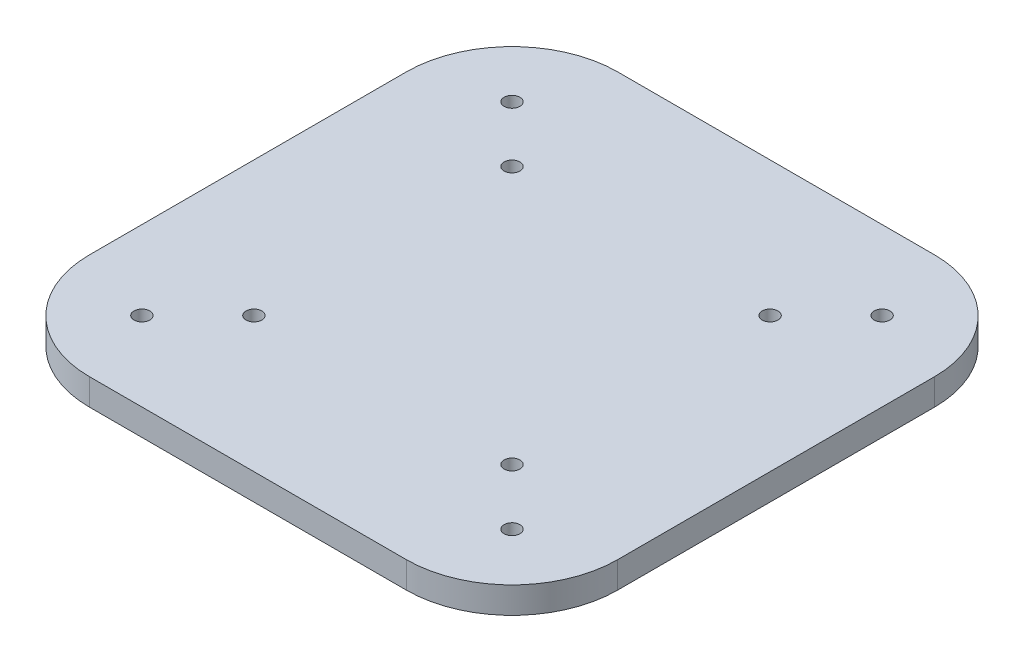
ISO-10303-21;
HEADER;
FILE_DESCRIPTION(('STEP AP214'),'2;1');
FILE_NAME('part.step','',(''),(''),'','','');
FILE_SCHEMA(('AUTOMOTIVE_DESIGN { 1 0 10303 214 1 1 1 1 }'));
ENDSEC;
DATA;
#1=APPLICATION_CONTEXT('core data for automotive mechanical design processes');
#2=APPLICATION_PROTOCOL_DEFINITION('international standard','automotive_design',2000,#1);
#3=PRODUCT_CONTEXT('',#1,'mechanical');
#4=PRODUCT('Part','Part','',(#3));
#5=PRODUCT_RELATED_PRODUCT_CATEGORY('part','',(#4));
#6=PRODUCT_DEFINITION_FORMATION('','',#4);
#7=PRODUCT_DEFINITION_CONTEXT('part definition',#1,'design');
#8=PRODUCT_DEFINITION('design','',#6,#7);
#9=PRODUCT_DEFINITION_SHAPE('','',#8);
#10=(LENGTH_UNIT() NAMED_UNIT(*) SI_UNIT(.MILLI.,.METRE.));
#11=(NAMED_UNIT(*) PLANE_ANGLE_UNIT() SI_UNIT($,.RADIAN.));
#12=(NAMED_UNIT(*) SI_UNIT($,.STERADIAN.) SOLID_ANGLE_UNIT());
#13=UNCERTAINTY_MEASURE_WITH_UNIT(LENGTH_MEASURE(1.E-05),#10,'distance_accuracy_value','');
#14=(GEOMETRIC_REPRESENTATION_CONTEXT(3) GLOBAL_UNCERTAINTY_ASSIGNED_CONTEXT((#13)) GLOBAL_UNIT_ASSIGNED_CONTEXT((#10,
#11,#12)) REPRESENTATION_CONTEXT('',''));
#15=CARTESIAN_POINT('',(0.,0.,0.));
#16=DIRECTION('',(0.,0.,1.));
#17=DIRECTION('',(1.,0.,0.));
#18=AXIS2_PLACEMENT_3D('',#15,#16,#17);
#19=CARTESIAN_POINT('',(17.5634517766497,5.,31.0152284263959));
#20=DIRECTION('',(0.,-1.,0.));
#21=DIRECTION('',(0.,0.,-1.));
#22=AXIS2_PLACEMENT_3D('',#19,#20,#21);
#23=PLANE('',#22);
#24=CARTESIAN_POINT('',(-36.917025001368,5.00000000000006,-23.4652483516218));
#25=DIRECTION('',(0.,1.,0.));
#26=DIRECTION('',(0.,0.,1.));
#27=AXIS2_PLACEMENT_3D('',#24,#25,#26);
#28=CIRCLE('',#27,1.49999999999999);
#29=CARTESIAN_POINT('',(-36.917025001368,5.00000000000006,-21.9652483516218));
#30=VERTEX_POINT('',#29);
#31=EDGE_CURVE('E211',#30,#30,#28,.T.);
#32=ORIENTED_EDGE('',*,*,#31,.F.);
#33=EDGE_LOOP('',(#32));
#34=FACE_BOUND('',#33,.T.);
#35=CARTESIAN_POINT('',(11.9568500588515,5.,25.4086267085977));
#36=DIRECTION('',(0.,1.,0.));
#37=DIRECTION('',(0.,0.,1.));
#38=AXIS2_PLACEMENT_3D('',#35,#36,#37);
#39=CIRCLE('',#38,1.49999999999999);
#40=CARTESIAN_POINT('',(11.9568500588515,5.,26.9086267085977));
#41=VERTEX_POINT('',#40);
#42=EDGE_CURVE('E184',#41,#41,#39,.T.);
#43=ORIENTED_EDGE('',*,*,#42,.F.);
#44=EDGE_LOOP('',(#43));
#45=FACE_BOUND('',#44,.T.);
#46=CARTESIAN_POINT('',(22.5634517766497,5.,36.0152284263959));
#47=DIRECTION('',(0.,1.,0.));
#48=DIRECTION('',(0.,0.,1.));
#49=AXIS2_PLACEMENT_3D('',#46,#47,#48);
#50=CIRCLE('',#49,1.49999999999999);
#51=CARTESIAN_POINT('',(22.5634517766497,5.,37.5152284263959));
#52=VERTEX_POINT('',#51);
#53=EDGE_CURVE('E181',#52,#52,#50,.T.);
#54=ORIENTED_EDGE('',*,*,#53,.F.);
#55=EDGE_LOOP('',(#54));
#56=FACE_BOUND('',#55,.T.);
#57=CARTESIAN_POINT('',(17.5634517766497,5.,31.0152284263959));
#58=DIRECTION('',(0.,1.,0.));
#59=DIRECTION('',(0.,0.,-1.));
#60=AXIS2_PLACEMENT_3D('',#57,#58,#59);
#61=CIRCLE('',#60,20.);
#62=CARTESIAN_POINT('',(17.5634517766496,5.,51.0152284263959));
#63=VERTEX_POINT('',#62);
#64=CARTESIAN_POINT('',(37.5634517766497,5.,31.0152284263958));
#65=VERTEX_POINT('',#64);
#66=EDGE_CURVE('E145',#63,#65,#61,.T.);
#67=ORIENTED_EDGE('',*,*,#66,.T.);
#68=DIRECTION('',(0.,0.,-1.));
#69=VECTOR('',#68,1.);
#70=CARTESIAN_POINT('',(37.5634517766497,5.,-28.9847715736039));
#71=LINE('',#70,#69);
#72=CARTESIAN_POINT('',(37.5634517766497,5.,-28.9847715736039));
#73=VERTEX_POINT('',#72);
#74=EDGE_CURVE('E93',#65,#73,#71,.T.);
#75=ORIENTED_EDGE('',*,*,#74,.T.);
#76=CARTESIAN_POINT('',(17.5634517766497,5.,-28.9847715736041));
#77=DIRECTION('',(0.,1.,0.));
#78=DIRECTION('',(0.,0.,1.));
#79=AXIS2_PLACEMENT_3D('',#76,#77,#78);
#80=CIRCLE('',#79,20.);
#81=CARTESIAN_POINT('',(17.5634517766495,5.,-48.9847715736041));
#82=VERTEX_POINT('',#81);
#83=EDGE_CURVE('E160',#73,#82,#80,.T.);
#84=ORIENTED_EDGE('',*,*,#83,.T.);
#85=DIRECTION('',(-1.,0.,0.));
#86=VECTOR('',#85,1.);
#87=CARTESIAN_POINT('',(-42.4365482233502,5.,-48.9847715736041));
#88=LINE('',#87,#86);
#89=CARTESIAN_POINT('',(-42.4365482233502,5.,-48.9847715736041));
#90=VERTEX_POINT('',#89);
#91=EDGE_CURVE('E173',#82,#90,#88,.T.);
#92=ORIENTED_EDGE('',*,*,#91,.T.);
#93=CARTESIAN_POINT('',(-42.4365482233503,5.,-28.9847715736041));
#94=DIRECTION('',(0.,1.,0.));
#95=DIRECTION('',(0.,0.,-1.));
#96=AXIS2_PLACEMENT_3D('',#93,#94,#95);
#97=CIRCLE('',#96,20.);
#98=CARTESIAN_POINT('',(-62.4365482233503,5.,-28.9847715736039));
#99=VERTEX_POINT('',#98);
#100=EDGE_CURVE('E112',#90,#99,#97,.T.);
#101=ORIENTED_EDGE('',*,*,#100,.T.);
#102=DIRECTION('',(0.,0.,1.));
#103=VECTOR('',#102,1.);
#104=CARTESIAN_POINT('',(-62.4365482233503,5.,-28.9847715736039));
#105=LINE('',#104,#103);
#106=CARTESIAN_POINT('',(-62.4365482233503,5.,31.0152284263958));
#107=VERTEX_POINT('',#106);
#108=EDGE_CURVE('E106',#99,#107,#105,.T.);
#109=ORIENTED_EDGE('',*,*,#108,.T.);
#110=CARTESIAN_POINT('',(-42.4365482233503,5.,31.0152284263959));
#111=DIRECTION('',(0.,1.,0.));
#112=DIRECTION('',(0.,0.,-1.));
#113=AXIS2_PLACEMENT_3D('',#110,#111,#112);
#114=CIRCLE('',#113,20.);
#115=CARTESIAN_POINT('',(-42.4365482233502,5.,51.0152284263959));
#116=VERTEX_POINT('',#115);
#117=EDGE_CURVE('E110',#107,#116,#114,.T.);
#118=ORIENTED_EDGE('',*,*,#117,.T.);
#119=DIRECTION('',(1.,0.,0.));
#120=VECTOR('',#119,1.);
#121=CARTESIAN_POINT('',(-42.4365482233502,5.,51.0152284263959));
#122=LINE('',#121,#120);
#123=EDGE_CURVE('E50',#116,#63,#122,.T.);
#124=ORIENTED_EDGE('',*,*,#123,.T.);
#125=EDGE_LOOP('',(#67,#75,#84,#92,#101,#109,#118,#124));
#126=FACE_BOUND('',#125,.T.);
#127=CARTESIAN_POINT('',(-47.5236267191664,5.00000000000008,36.0152284263958));
#128=DIRECTION('',(0.,1.,0.));
#129=DIRECTION('',(0.,0.,1.));
#130=AXIS2_PLACEMENT_3D('',#127,#128,#129);
#131=CIRCLE('',#130,1.49999999999999);
#132=CARTESIAN_POINT('',(-47.5236267191664,5.00000000000008,37.5152284263958));
#133=VERTEX_POINT('',#132);
#134=EDGE_CURVE('E193',#133,#133,#131,.T.);
#135=ORIENTED_EDGE('',*,*,#134,.F.);
#136=EDGE_LOOP('',(#135));
#137=FACE_BOUND('',#136,.T.);
#138=CARTESIAN_POINT('',(-36.9170250013681,5.00000000000006,25.4086267085976));
#139=DIRECTION('',(0.,1.,0.));
#140=DIRECTION('',(0.,0.,1.));
#141=AXIS2_PLACEMENT_3D('',#138,#139,#140);
#142=CIRCLE('',#141,1.49999999999999);
#143=CARTESIAN_POINT('',(-36.9170250013681,5.00000000000006,26.9086267085976));
#144=VERTEX_POINT('',#143);
#145=EDGE_CURVE('E199',#144,#144,#142,.T.);
#146=ORIENTED_EDGE('',*,*,#145,.F.);
#147=EDGE_LOOP('',(#146));
#148=FACE_BOUND('',#147,.T.);
#149=CARTESIAN_POINT('',(-47.5236267191662,5.00000000000008,-34.07185006942));
#150=DIRECTION('',(0.,1.,0.));
#151=DIRECTION('',(0.,0.,1.));
#152=AXIS2_PLACEMENT_3D('',#149,#150,#151);
#153=CIRCLE('',#152,1.49999999999999);
#154=CARTESIAN_POINT('',(-47.5236267191662,5.00000000000008,-32.57185006942));
#155=VERTEX_POINT('',#154);
#156=EDGE_CURVE('E205',#155,#155,#153,.T.);
#157=ORIENTED_EDGE('',*,*,#156,.F.);
#158=EDGE_LOOP('',(#157));
#159=FACE_BOUND('',#158,.T.);
#160=CARTESIAN_POINT('',(22.5634517766501,5.00000000000001,-34.0718500694196));
#161=DIRECTION('',(0.,1.,0.));
#162=DIRECTION('',(0.,0.,1.));
#163=AXIS2_PLACEMENT_3D('',#160,#161,#162);
#164=CIRCLE('',#163,1.49999999999999);
#165=CARTESIAN_POINT('',(22.5634517766501,5.,-32.5718500694197));
#166=VERTEX_POINT('',#165);
#167=EDGE_CURVE('E217',#166,#166,#164,.T.);
#168=ORIENTED_EDGE('',*,*,#167,.F.);
#169=EDGE_LOOP('',(#168));
#170=FACE_BOUND('',#169,.T.);
#171=CARTESIAN_POINT('',(11.9568500588518,5.,-23.4652483516215));
#172=DIRECTION('',(0.,1.,0.));
#173=DIRECTION('',(0.,0.,1.));
#174=AXIS2_PLACEMENT_3D('',#171,#172,#173);
#175=CIRCLE('',#174,1.49999999999999);
#176=CARTESIAN_POINT('',(11.9568500588518,5.,-21.9652483516216));
#177=VERTEX_POINT('',#176);
#178=EDGE_CURVE('E223',#177,#177,#175,.T.);
#179=ORIENTED_EDGE('',*,*,#178,.F.);
#180=EDGE_LOOP('',(#179));
#181=FACE_BOUND('',#180,.T.);
#182=ADVANCED_FACE('F33',(#34,#45,#56,#126,#137,#148,#159,#170,#181),#23,.F.);
#183=CARTESIAN_POINT('',(17.5634517766497,0.,31.0152284263959));
#184=DIRECTION('',(0.,-1.,0.));
#185=DIRECTION('',(0.,0.,-1.));
#186=AXIS2_PLACEMENT_3D('',#183,#184,#185);
#187=PLANE('',#186);
#188=CARTESIAN_POINT('',(-36.917025001368,0.,-23.4652483516218));
#189=DIRECTION('',(0.,1.,0.));
#190=DIRECTION('',(0.,0.,1.));
#191=AXIS2_PLACEMENT_3D('',#188,#189,#190);
#192=CIRCLE('',#191,1.5);
#193=CARTESIAN_POINT('',(-36.917025001368,0.,-21.9652483516218));
#194=VERTEX_POINT('',#193);
#195=EDGE_CURVE('E208',#194,#194,#192,.T.);
#196=ORIENTED_EDGE('',*,*,#195,.T.);
#197=EDGE_LOOP('',(#196));
#198=FACE_BOUND('',#197,.T.);
#199=CARTESIAN_POINT('',(-36.9170250013681,0.,25.4086267085976));
#200=DIRECTION('',(0.,1.,0.));
#201=DIRECTION('',(0.,0.,1.));
#202=AXIS2_PLACEMENT_3D('',#199,#200,#201);
#203=CIRCLE('',#202,1.5);
#204=CARTESIAN_POINT('',(-36.9170250013681,0.,26.9086267085976));
#205=VERTEX_POINT('',#204);
#206=EDGE_CURVE('E196',#205,#205,#203,.T.);
#207=ORIENTED_EDGE('',*,*,#206,.T.);
#208=EDGE_LOOP('',(#207));
#209=FACE_BOUND('',#208,.T.);
#210=CARTESIAN_POINT('',(17.5634517766497,0.,31.0152284263959));
#211=DIRECTION('',(0.,1.,0.));
#212=DIRECTION('',(0.,0.,-1.));
#213=AXIS2_PLACEMENT_3D('',#210,#211,#212);
#214=CIRCLE('',#213,20.);
#215=CARTESIAN_POINT('',(17.5634517766496,0.,51.0152284263959));
#216=VERTEX_POINT('',#215);
#217=CARTESIAN_POINT('',(37.5634517766497,0.,31.0152284263958));
#218=VERTEX_POINT('',#217);
#219=EDGE_CURVE('E130',#216,#218,#214,.T.);
#220=ORIENTED_EDGE('',*,*,#219,.F.);
#221=DIRECTION('',(1.,0.,0.));
#222=VECTOR('',#221,1.);
#223=CARTESIAN_POINT('',(-42.4365482233502,0.,51.0152284263959));
#224=LINE('',#223,#222);
#225=CARTESIAN_POINT('',(-42.4365482233502,0.,51.0152284263959));
#226=VERTEX_POINT('',#225);
#227=EDGE_CURVE('E85',#226,#216,#224,.T.);
#228=ORIENTED_EDGE('',*,*,#227,.F.);
#229=CARTESIAN_POINT('',(-42.4365482233503,0.,31.0152284263959));
#230=DIRECTION('',(0.,1.,0.));
#231=DIRECTION('',(0.,0.,-1.));
#232=AXIS2_PLACEMENT_3D('',#229,#230,#231);
#233=CIRCLE('',#232,20.);
#234=CARTESIAN_POINT('',(-62.4365482233503,0.,31.0152284263958));
#235=VERTEX_POINT('',#234);
#236=EDGE_CURVE('E79',#235,#226,#233,.T.);
#237=ORIENTED_EDGE('',*,*,#236,.F.);
#238=DIRECTION('',(0.,0.,1.));
#239=VECTOR('',#238,1.);
#240=CARTESIAN_POINT('',(-62.4365482233503,0.,-28.9847715736039));
#241=LINE('',#240,#239);
#242=CARTESIAN_POINT('',(-62.4365482233503,0.,-28.9847715736039));
#243=VERTEX_POINT('',#242);
#244=EDGE_CURVE('E120',#243,#235,#241,.T.);
#245=ORIENTED_EDGE('',*,*,#244,.F.);
#246=CARTESIAN_POINT('',(-42.4365482233503,0.,-28.9847715736041));
#247=DIRECTION('',(0.,1.,0.));
#248=DIRECTION('',(0.,0.,-1.));
#249=AXIS2_PLACEMENT_3D('',#246,#247,#248);
#250=CIRCLE('',#249,20.);
#251=CARTESIAN_POINT('',(-42.4365482233502,0.,-48.9847715736041));
#252=VERTEX_POINT('',#251);
#253=EDGE_CURVE('E140',#252,#243,#250,.T.);
#254=ORIENTED_EDGE('',*,*,#253,.F.);
#255=DIRECTION('',(-1.,0.,0.));
#256=VECTOR('',#255,1.);
#257=CARTESIAN_POINT('',(-42.4365482233502,0.,-48.9847715736041));
#258=LINE('',#257,#256);
#259=CARTESIAN_POINT('',(17.5634517766495,0.,-48.9847715736041));
#260=VERTEX_POINT('',#259);
#261=EDGE_CURVE('E138',#260,#252,#258,.T.);
#262=ORIENTED_EDGE('',*,*,#261,.F.);
#263=CARTESIAN_POINT('',(17.5634517766497,0.,-28.9847715736041));
#264=DIRECTION('',(0.,1.,0.));
#265=DIRECTION('',(0.,0.,1.));
#266=AXIS2_PLACEMENT_3D('',#263,#264,#265);
#267=CIRCLE('',#266,20.);
#268=CARTESIAN_POINT('',(37.5634517766497,0.,-28.9847715736039));
#269=VERTEX_POINT('',#268);
#270=EDGE_CURVE('E136',#269,#260,#267,.T.);
#271=ORIENTED_EDGE('',*,*,#270,.F.);
#272=DIRECTION('',(0.,0.,-1.));
#273=VECTOR('',#272,1.);
#274=CARTESIAN_POINT('',(37.5634517766497,0.,-28.9847715736039));
#275=LINE('',#274,#273);
#276=EDGE_CURVE('E133',#218,#269,#275,.T.);
#277=ORIENTED_EDGE('',*,*,#276,.F.);
#278=EDGE_LOOP('',(#220,#228,#237,#245,#254,#262,#271,#277));
#279=FACE_BOUND('',#278,.T.);
#280=CARTESIAN_POINT('',(22.5634517766497,0.,36.0152284263959));
#281=DIRECTION('',(0.,1.,0.));
#282=DIRECTION('',(0.,0.,1.));
#283=AXIS2_PLACEMENT_3D('',#280,#281,#282);
#284=CIRCLE('',#283,1.5);
#285=CARTESIAN_POINT('',(22.5634517766497,0.,37.5152284263959));
#286=VERTEX_POINT('',#285);
#287=EDGE_CURVE('E134',#286,#286,#284,.T.);
#288=ORIENTED_EDGE('',*,*,#287,.T.);
#289=EDGE_LOOP('',(#288));
#290=FACE_BOUND('',#289,.T.);
#291=CARTESIAN_POINT('',(11.9568500588515,0.,25.4086267085977));
#292=DIRECTION('',(0.,1.,0.));
#293=DIRECTION('',(0.,0.,1.));
#294=AXIS2_PLACEMENT_3D('',#291,#292,#293);
#295=CIRCLE('',#294,1.5);
#296=CARTESIAN_POINT('',(11.9568500588515,0.,26.9086267085977));
#297=VERTEX_POINT('',#296);
#298=EDGE_CURVE('E187',#297,#297,#295,.T.);
#299=ORIENTED_EDGE('',*,*,#298,.T.);
#300=EDGE_LOOP('',(#299));
#301=FACE_BOUND('',#300,.T.);
#302=CARTESIAN_POINT('',(-47.5236267191664,0.,36.0152284263958));
#303=DIRECTION('',(0.,1.,0.));
#304=DIRECTION('',(0.,0.,1.));
#305=AXIS2_PLACEMENT_3D('',#302,#303,#304);
#306=CIRCLE('',#305,1.5);
#307=CARTESIAN_POINT('',(-47.5236267191664,0.,37.5152284263958));
#308=VERTEX_POINT('',#307);
#309=EDGE_CURVE('E190',#308,#308,#306,.T.);
#310=ORIENTED_EDGE('',*,*,#309,.T.);
#311=EDGE_LOOP('',(#310));
#312=FACE_BOUND('',#311,.T.);
#313=CARTESIAN_POINT('',(-47.5236267191662,0.,-34.07185006942));
#314=DIRECTION('',(0.,1.,0.));
#315=DIRECTION('',(0.,0.,1.));
#316=AXIS2_PLACEMENT_3D('',#313,#314,#315);
#317=CIRCLE('',#316,1.5);
#318=CARTESIAN_POINT('',(-47.5236267191662,0.,-32.57185006942));
#319=VERTEX_POINT('',#318);
#320=EDGE_CURVE('E202',#319,#319,#317,.T.);
#321=ORIENTED_EDGE('',*,*,#320,.T.);
#322=EDGE_LOOP('',(#321));
#323=FACE_BOUND('',#322,.T.);
#324=CARTESIAN_POINT('',(22.5634517766501,0.,-34.0718500694197));
#325=DIRECTION('',(0.,1.,0.));
#326=DIRECTION('',(0.,0.,1.));
#327=AXIS2_PLACEMENT_3D('',#324,#325,#326);
#328=CIRCLE('',#327,1.5);
#329=CARTESIAN_POINT('',(22.5634517766501,0.,-32.5718500694197));
#330=VERTEX_POINT('',#329);
#331=EDGE_CURVE('E214',#330,#330,#328,.T.);
#332=ORIENTED_EDGE('',*,*,#331,.T.);
#333=EDGE_LOOP('',(#332));
#334=FACE_BOUND('',#333,.T.);
#335=CARTESIAN_POINT('',(11.9568500588518,0.,-23.4652483516215));
#336=DIRECTION('',(0.,1.,0.));
#337=DIRECTION('',(0.,0.,1.));
#338=AXIS2_PLACEMENT_3D('',#335,#336,#337);
#339=CIRCLE('',#338,1.5);
#340=CARTESIAN_POINT('',(11.9568500588518,0.,-21.9652483516215));
#341=VERTEX_POINT('',#340);
#342=EDGE_CURVE('E220',#341,#341,#339,.T.);
#343=ORIENTED_EDGE('',*,*,#342,.T.);
#344=EDGE_LOOP('',(#343));
#345=FACE_BOUND('',#344,.T.);
#346=ADVANCED_FACE('F164',(#198,#209,#279,#290,#301,#312,#323,#334,#345),#187,.T.);
#347=CARTESIAN_POINT('',(17.5634517766497,5.,31.0152284263959));
#348=DIRECTION('',(0.,-1.,0.));
#349=DIRECTION('',(0.,0.,-1.));
#350=AXIS2_PLACEMENT_3D('',#347,#348,#349);
#351=CYLINDRICAL_SURFACE('',#350,20.);
#352=ORIENTED_EDGE('',*,*,#219,.T.);
#353=DIRECTION('',(0.,-1.,0.));
#354=VECTOR('',#353,1.);
#355=CARTESIAN_POINT('',(37.5634517766497,5.,31.0152284263958));
#356=LINE('',#355,#354);
#357=EDGE_CURVE('E11',#65,#218,#356,.T.);
#358=ORIENTED_EDGE('',*,*,#357,.F.);
#359=ORIENTED_EDGE('',*,*,#66,.F.);
#360=DIRECTION('',(0.,-1.,0.));
#361=VECTOR('',#360,1.);
#362=CARTESIAN_POINT('',(17.5634517766496,5.,51.0152284263959));
#363=LINE('',#362,#361);
#364=EDGE_CURVE('E126',#63,#216,#363,.T.);
#365=ORIENTED_EDGE('',*,*,#364,.T.);
#366=EDGE_LOOP('',(#352,#358,#359,#365));
#367=FACE_BOUND('',#366,.T.);
#368=ADVANCED_FACE('F35',(#367),#351,.T.);
#369=CARTESIAN_POINT('',(37.5634517766497,5.,-28.9847715736039));
#370=DIRECTION('',(-1.,0.,0.));
#371=DIRECTION('',(0.,0.,1.));
#372=AXIS2_PLACEMENT_3D('',#369,#370,#371);
#373=PLANE('',#372);
#374=ORIENTED_EDGE('',*,*,#276,.T.);
#375=DIRECTION('',(0.,-1.,0.));
#376=VECTOR('',#375,1.);
#377=CARTESIAN_POINT('',(37.5634517766497,5.,-28.9847715736039));
#378=LINE('',#377,#376);
#379=EDGE_CURVE('E42',#73,#269,#378,.T.);
#380=ORIENTED_EDGE('',*,*,#379,.F.);
#381=ORIENTED_EDGE('',*,*,#74,.F.);
#382=ORIENTED_EDGE('',*,*,#357,.T.);
#383=EDGE_LOOP('',(#374,#380,#381,#382));
#384=FACE_BOUND('',#383,.T.);
#385=ADVANCED_FACE('F256',(#384),#373,.F.);
#386=CARTESIAN_POINT('',(17.5634517766497,5.,-28.9847715736041));
#387=DIRECTION('',(0.,-1.,0.));
#388=DIRECTION('',(0.,0.,-1.));
#389=AXIS2_PLACEMENT_3D('',#386,#387,#388);
#390=CYLINDRICAL_SURFACE('',#389,20.);
#391=ORIENTED_EDGE('',*,*,#270,.T.);
#392=DIRECTION('',(0.,-1.,0.));
#393=VECTOR('',#392,1.);
#394=CARTESIAN_POINT('',(17.5634517766495,5.,-48.9847715736041));
#395=LINE('',#394,#393);
#396=EDGE_CURVE('E152',#82,#260,#395,.T.);
#397=ORIENTED_EDGE('',*,*,#396,.F.);
#398=ORIENTED_EDGE('',*,*,#83,.F.);
#399=ORIENTED_EDGE('',*,*,#379,.T.);
#400=EDGE_LOOP('',(#391,#397,#398,#399));
#401=FACE_BOUND('',#400,.T.);
#402=ADVANCED_FACE('F158',(#401),#390,.T.);
#403=CARTESIAN_POINT('',(-42.4365482233502,5.,-48.9847715736041));
#404=DIRECTION('',(0.,0.,1.));
#405=DIRECTION('',(1.,0.,0.));
#406=AXIS2_PLACEMENT_3D('',#403,#404,#405);
#407=PLANE('',#406);
#408=ORIENTED_EDGE('',*,*,#261,.T.);
#409=DIRECTION('',(0.,-1.,0.));
#410=VECTOR('',#409,1.);
#411=CARTESIAN_POINT('',(-42.4365482233502,5.,-48.9847715736041));
#412=LINE('',#411,#410);
#413=EDGE_CURVE('E149',#90,#252,#412,.T.);
#414=ORIENTED_EDGE('',*,*,#413,.F.);
#415=ORIENTED_EDGE('',*,*,#91,.F.);
#416=ORIENTED_EDGE('',*,*,#396,.T.);
#417=EDGE_LOOP('',(#408,#414,#415,#416));
#418=FACE_BOUND('',#417,.T.);
#419=ADVANCED_FACE('F169',(#418),#407,.F.);
#420=CARTESIAN_POINT('',(-42.4365482233503,5.,-28.9847715736041));
#421=DIRECTION('',(0.,-1.,0.));
#422=DIRECTION('',(0.,0.,-1.));
#423=AXIS2_PLACEMENT_3D('',#420,#421,#422);
#424=CYLINDRICAL_SURFACE('',#423,20.);
#425=ORIENTED_EDGE('',*,*,#253,.T.);
#426=DIRECTION('',(0.,-1.,0.));
#427=VECTOR('',#426,1.);
#428=CARTESIAN_POINT('',(-62.4365482233503,5.,-28.9847715736039));
#429=LINE('',#428,#427);
#430=EDGE_CURVE('E121',#99,#243,#429,.T.);
#431=ORIENTED_EDGE('',*,*,#430,.F.);
#432=ORIENTED_EDGE('',*,*,#100,.F.);
#433=ORIENTED_EDGE('',*,*,#413,.T.);
#434=EDGE_LOOP('',(#425,#431,#432,#433));
#435=FACE_BOUND('',#434,.T.);
#436=ADVANCED_FACE('F172',(#435),#424,.T.);
#437=CARTESIAN_POINT('',(-62.4365482233503,5.,-28.9847715736039));
#438=DIRECTION('',(1.,0.,0.));
#439=DIRECTION('',(0.,0.,-1.));
#440=AXIS2_PLACEMENT_3D('',#437,#438,#439);
#441=PLANE('',#440);
#442=ORIENTED_EDGE('',*,*,#244,.T.);
#443=DIRECTION('',(0.,-1.,0.));
#444=VECTOR('',#443,1.);
#445=CARTESIAN_POINT('',(-62.4365482233503,5.,31.0152284263958));
#446=LINE('',#445,#444);
#447=EDGE_CURVE('E117',#107,#235,#446,.T.);
#448=ORIENTED_EDGE('',*,*,#447,.F.);
#449=ORIENTED_EDGE('',*,*,#108,.F.);
#450=ORIENTED_EDGE('',*,*,#430,.T.);
#451=EDGE_LOOP('',(#442,#448,#449,#450));
#452=FACE_BOUND('',#451,.T.);
#453=ADVANCED_FACE('F118',(#452),#441,.F.);
#454=CARTESIAN_POINT('',(-42.4365482233503,5.,31.0152284263959));
#455=DIRECTION('',(0.,-1.,0.));
#456=DIRECTION('',(0.,0.,-1.));
#457=AXIS2_PLACEMENT_3D('',#454,#455,#456);
#458=CYLINDRICAL_SURFACE('',#457,20.);
#459=ORIENTED_EDGE('',*,*,#236,.T.);
#460=DIRECTION('',(0.,-1.,0.));
#461=VECTOR('',#460,1.);
#462=CARTESIAN_POINT('',(-42.4365482233502,5.,51.0152284263959));
#463=LINE('',#462,#461);
#464=EDGE_CURVE('E122',#116,#226,#463,.T.);
#465=ORIENTED_EDGE('',*,*,#464,.F.);
#466=ORIENTED_EDGE('',*,*,#117,.F.);
#467=ORIENTED_EDGE('',*,*,#447,.T.);
#468=EDGE_LOOP('',(#459,#465,#466,#467));
#469=FACE_BOUND('',#468,.T.);
#470=ADVANCED_FACE('F124',(#469),#458,.T.);
#471=CARTESIAN_POINT('',(-42.4365482233502,5.,51.0152284263959));
#472=DIRECTION('',(0.,0.,-1.));
#473=DIRECTION('',(-1.,0.,0.));
#474=AXIS2_PLACEMENT_3D('',#471,#472,#473);
#475=PLANE('',#474);
#476=ORIENTED_EDGE('',*,*,#227,.T.);
#477=ORIENTED_EDGE('',*,*,#364,.F.);
#478=ORIENTED_EDGE('',*,*,#123,.F.);
#479=ORIENTED_EDGE('',*,*,#464,.T.);
#480=EDGE_LOOP('',(#476,#477,#478,#479));
#481=FACE_BOUND('',#480,.T.);
#482=ADVANCED_FACE('F244',(#481),#475,.F.);
#483=CARTESIAN_POINT('',(22.5634517766497,5.,36.0152284263959));
#484=DIRECTION('',(0.,1.,0.));
#485=DIRECTION('',(0.,0.,1.));
#486=AXIS2_PLACEMENT_3D('',#483,#484,#485);
#487=CYLINDRICAL_SURFACE('',#486,1.49999999999999);
#488=ORIENTED_EDGE('',*,*,#287,.F.);
#489=EDGE_LOOP('',(#488));
#490=FACE_BOUND('',#489,.T.);
#491=ORIENTED_EDGE('',*,*,#53,.T.);
#492=EDGE_LOOP('',(#491));
#493=FACE_BOUND('',#492,.T.);
#494=ADVANCED_FACE('F241',(#490,#493),#487,.F.);
#495=CARTESIAN_POINT('',(11.9568500588515,5.,25.4086267085977));
#496=DIRECTION('',(0.,1.,0.));
#497=DIRECTION('',(0.,0.,1.));
#498=AXIS2_PLACEMENT_3D('',#495,#496,#497);
#499=CYLINDRICAL_SURFACE('',#498,1.49999999999999);
#500=ORIENTED_EDGE('',*,*,#298,.F.);
#501=EDGE_LOOP('',(#500));
#502=FACE_BOUND('',#501,.T.);
#503=ORIENTED_EDGE('',*,*,#42,.T.);
#504=EDGE_LOOP('',(#503));
#505=FACE_BOUND('',#504,.T.);
#506=ADVANCED_FACE('F314',(#502,#505),#499,.F.);
#507=CARTESIAN_POINT('',(-47.5236267191664,5.00000000000008,36.0152284263958));
#508=DIRECTION('',(0.,1.,0.));
#509=DIRECTION('',(0.,0.,1.));
#510=AXIS2_PLACEMENT_3D('',#507,#508,#509);
#511=CYLINDRICAL_SURFACE('',#510,1.49999999999999);
#512=ORIENTED_EDGE('',*,*,#309,.F.);
#513=EDGE_LOOP('',(#512));
#514=FACE_BOUND('',#513,.T.);
#515=ORIENTED_EDGE('',*,*,#134,.T.);
#516=EDGE_LOOP('',(#515));
#517=FACE_BOUND('',#516,.T.);
#518=ADVANCED_FACE('F322',(#514,#517),#511,.F.);
#519=CARTESIAN_POINT('',(-36.9170250013681,5.00000000000005,25.4086267085976));
#520=DIRECTION('',(0.,1.,0.));
#521=DIRECTION('',(0.,0.,1.));
#522=AXIS2_PLACEMENT_3D('',#519,#520,#521);
#523=CYLINDRICAL_SURFACE('',#522,1.49999999999999);
#524=ORIENTED_EDGE('',*,*,#206,.F.);
#525=EDGE_LOOP('',(#524));
#526=FACE_BOUND('',#525,.T.);
#527=ORIENTED_EDGE('',*,*,#145,.T.);
#528=EDGE_LOOP('',(#527));
#529=FACE_BOUND('',#528,.T.);
#530=ADVANCED_FACE('F341',(#526,#529),#523,.F.);
#531=CARTESIAN_POINT('',(-47.5236267191662,5.00000000000008,-34.07185006942));
#532=DIRECTION('',(0.,1.,0.));
#533=DIRECTION('',(0.,0.,1.));
#534=AXIS2_PLACEMENT_3D('',#531,#532,#533);
#535=CYLINDRICAL_SURFACE('',#534,1.49999999999999);
#536=ORIENTED_EDGE('',*,*,#320,.F.);
#537=EDGE_LOOP('',(#536));
#538=FACE_BOUND('',#537,.T.);
#539=ORIENTED_EDGE('',*,*,#156,.T.);
#540=EDGE_LOOP('',(#539));
#541=FACE_BOUND('',#540,.T.);
#542=ADVANCED_FACE('F348',(#538,#541),#535,.F.);
#543=CARTESIAN_POINT('',(-36.917025001368,5.00000000000006,-23.4652483516218));
#544=DIRECTION('',(0.,1.,0.));
#545=DIRECTION('',(0.,0.,1.));
#546=AXIS2_PLACEMENT_3D('',#543,#544,#545);
#547=CYLINDRICAL_SURFACE('',#546,1.49999999999999);
#548=ORIENTED_EDGE('',*,*,#195,.F.);
#549=EDGE_LOOP('',(#548));
#550=FACE_BOUND('',#549,.T.);
#551=ORIENTED_EDGE('',*,*,#31,.T.);
#552=EDGE_LOOP('',(#551));
#553=FACE_BOUND('',#552,.T.);
#554=ADVANCED_FACE('F356',(#550,#553),#547,.F.);
#555=CARTESIAN_POINT('',(22.5634517766501,5.,-34.0718500694196));
#556=DIRECTION('',(0.,1.,0.));
#557=DIRECTION('',(0.,0.,1.));
#558=AXIS2_PLACEMENT_3D('',#555,#556,#557);
#559=CYLINDRICAL_SURFACE('',#558,1.49999999999999);
#560=ORIENTED_EDGE('',*,*,#331,.F.);
#561=EDGE_LOOP('',(#560));
#562=FACE_BOUND('',#561,.T.);
#563=ORIENTED_EDGE('',*,*,#167,.T.);
#564=EDGE_LOOP('',(#563));
#565=FACE_BOUND('',#564,.T.);
#566=ADVANCED_FACE('F364',(#562,#565),#559,.F.);
#567=CARTESIAN_POINT('',(11.9568500588518,5.,-23.4652483516215));
#568=DIRECTION('',(0.,1.,0.));
#569=DIRECTION('',(0.,0.,1.));
#570=AXIS2_PLACEMENT_3D('',#567,#568,#569);
#571=CYLINDRICAL_SURFACE('',#570,1.49999999999999);
#572=ORIENTED_EDGE('',*,*,#342,.F.);
#573=EDGE_LOOP('',(#572));
#574=FACE_BOUND('',#573,.T.);
#575=ORIENTED_EDGE('',*,*,#178,.T.);
#576=EDGE_LOOP('',(#575));
#577=FACE_BOUND('',#576,.T.);
#578=ADVANCED_FACE('F227',(#574,#577),#571,.F.);
#579=CLOSED_SHELL('',(#182,#346,#368,#385,#402,#419,#436,#453,#470,#482,#494,#506,#518,#530,
#542,#554,#566,#578));
#580=MANIFOLD_SOLID_BREP('B2',#579);
#581=ADVANCED_BREP_SHAPE_REPRESENTATION('',(#18,#580),#14);
#582=SHAPE_DEFINITION_REPRESENTATION(#9,#581);
ENDSEC;
END-ISO-10303-21;
